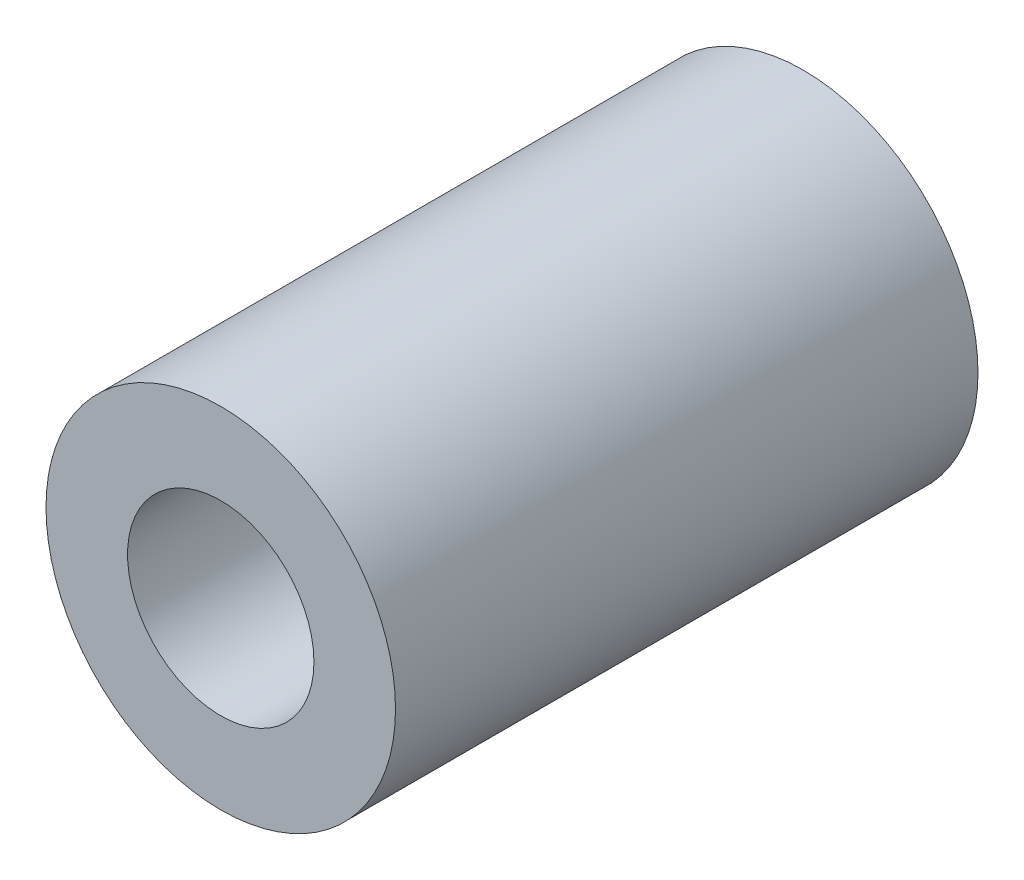
ISO-10303-21;
HEADER;
FILE_DESCRIPTION(('STEP AP214'),'2;1');
FILE_NAME('part.step','',(''),(''),'','','');
FILE_SCHEMA(('AUTOMOTIVE_DESIGN { 1 0 10303 214 1 1 1 1 }'));
ENDSEC;
DATA;
#1=APPLICATION_CONTEXT('core data for automotive mechanical design processes');
#2=APPLICATION_PROTOCOL_DEFINITION('international standard','automotive_design',2000,#1);
#3=PRODUCT_CONTEXT('',#1,'mechanical');
#4=PRODUCT('Part','Part','',(#3));
#5=PRODUCT_RELATED_PRODUCT_CATEGORY('part','',(#4));
#6=PRODUCT_DEFINITION_FORMATION('','',#4);
#7=PRODUCT_DEFINITION_CONTEXT('part definition',#1,'design');
#8=PRODUCT_DEFINITION('design','',#6,#7);
#9=PRODUCT_DEFINITION_SHAPE('','',#8);
#10=(LENGTH_UNIT() NAMED_UNIT(*) SI_UNIT(.MILLI.,.METRE.));
#11=(NAMED_UNIT(*) PLANE_ANGLE_UNIT() SI_UNIT($,.RADIAN.));
#12=(NAMED_UNIT(*) SI_UNIT($,.STERADIAN.) SOLID_ANGLE_UNIT());
#13=UNCERTAINTY_MEASURE_WITH_UNIT(LENGTH_MEASURE(1.E-05),#10,'distance_accuracy_value','');
#14=(GEOMETRIC_REPRESENTATION_CONTEXT(3) GLOBAL_UNCERTAINTY_ASSIGNED_CONTEXT((#13)) GLOBAL_UNIT_ASSIGNED_CONTEXT((#10,
#11,#12)) REPRESENTATION_CONTEXT('',''));
#15=CARTESIAN_POINT('',(0.,0.,0.));
#16=DIRECTION('',(0.,0.,1.));
#17=DIRECTION('',(1.,0.,0.));
#18=AXIS2_PLACEMENT_3D('',#15,#16,#17);
#19=CARTESIAN_POINT('',(0.,0.,5.));
#20=DIRECTION('',(0.,0.,1.));
#21=DIRECTION('',(1.,0.,0.));
#22=AXIS2_PLACEMENT_3D('',#19,#20,#21);
#23=PLANE('',#22);
#24=CARTESIAN_POINT('',(0.,0.,5.));
#25=DIRECTION('',(0.,0.,1.));
#26=DIRECTION('',(1.,0.,0.));
#27=AXIS2_PLACEMENT_3D('',#24,#25,#26);
#28=CIRCLE('',#27,3.);
#29=CARTESIAN_POINT('',(3.,0.,5.));
#30=VERTEX_POINT('',#29);
#31=EDGE_CURVE('E10',#30,#30,#28,.T.);
#32=ORIENTED_EDGE('',*,*,#31,.T.);
#33=EDGE_LOOP('',(#32));
#34=FACE_BOUND('',#33,.T.);
#35=CARTESIAN_POINT('',(0.,0.,5.));
#36=DIRECTION('',(0.,0.,1.));
#37=DIRECTION('',(1.,0.,0.));
#38=AXIS2_PLACEMENT_3D('',#35,#36,#37);
#39=CIRCLE('',#38,1.6);
#40=CARTESIAN_POINT('',(1.6,0.,5.));
#41=VERTEX_POINT('',#40);
#42=EDGE_CURVE('E42',#41,#41,#39,.T.);
#43=ORIENTED_EDGE('',*,*,#42,.F.);
#44=EDGE_LOOP('',(#43));
#45=FACE_BOUND('',#44,.T.);
#46=ADVANCED_FACE('F31',(#34,#45),#23,.T.);
#47=CARTESIAN_POINT('',(0.,0.,-5.));
#48=DIRECTION('',(0.,0.,1.));
#49=DIRECTION('',(1.,0.,0.));
#50=AXIS2_PLACEMENT_3D('',#47,#48,#49);
#51=PLANE('',#50);
#52=CARTESIAN_POINT('',(0.,0.,-5.));
#53=DIRECTION('',(0.,0.,1.));
#54=DIRECTION('',(1.,0.,0.));
#55=AXIS2_PLACEMENT_3D('',#52,#53,#54);
#56=CIRCLE('',#55,3.);
#57=CARTESIAN_POINT('',(3.,0.,-5.));
#58=VERTEX_POINT('',#57);
#59=EDGE_CURVE('E35',#58,#58,#56,.T.);
#60=ORIENTED_EDGE('',*,*,#59,.F.);
#61=EDGE_LOOP('',(#60));
#62=FACE_BOUND('',#61,.T.);
#63=CARTESIAN_POINT('',(0.,0.,-5.));
#64=DIRECTION('',(0.,0.,1.));
#65=DIRECTION('',(1.,0.,0.));
#66=AXIS2_PLACEMENT_3D('',#63,#64,#65);
#67=CIRCLE('',#66,1.6);
#68=CARTESIAN_POINT('',(1.6,0.,-5.));
#69=VERTEX_POINT('',#68);
#70=EDGE_CURVE('E44',#69,#69,#67,.T.);
#71=ORIENTED_EDGE('',*,*,#70,.T.);
#72=EDGE_LOOP('',(#71));
#73=FACE_BOUND('',#72,.T.);
#74=ADVANCED_FACE('F54',(#62,#73),#51,.F.);
#75=CARTESIAN_POINT('',(0.,0.,5.));
#76=DIRECTION('',(0.,0.,-1.));
#77=DIRECTION('',(-1.,0.,0.));
#78=AXIS2_PLACEMENT_3D('',#75,#76,#77);
#79=CYLINDRICAL_SURFACE('',#78,3.);
#80=ORIENTED_EDGE('',*,*,#31,.F.);
#81=EDGE_LOOP('',(#80));
#82=FACE_BOUND('',#81,.T.);
#83=ORIENTED_EDGE('',*,*,#59,.T.);
#84=EDGE_LOOP('',(#83));
#85=FACE_BOUND('',#84,.T.);
#86=ADVANCED_FACE('F33',(#82,#85),#79,.T.);
#87=CARTESIAN_POINT('',(0.,0.,5.));
#88=DIRECTION('',(0.,0.,-1.));
#89=DIRECTION('',(-1.,0.,0.));
#90=AXIS2_PLACEMENT_3D('',#87,#88,#89);
#91=CYLINDRICAL_SURFACE('',#90,1.6);
#92=ORIENTED_EDGE('',*,*,#42,.T.);
#93=EDGE_LOOP('',(#92));
#94=FACE_BOUND('',#93,.T.);
#95=ORIENTED_EDGE('',*,*,#70,.F.);
#96=EDGE_LOOP('',(#95));
#97=FACE_BOUND('',#96,.T.);
#98=ADVANCED_FACE('F50',(#94,#97),#91,.F.);
#99=CLOSED_SHELL('',(#46,#74,#86,#98));
#100=MANIFOLD_SOLID_BREP('B2',#99);
#101=ADVANCED_BREP_SHAPE_REPRESENTATION('',(#18,#100),#14);
#102=SHAPE_DEFINITION_REPRESENTATION(#9,#101);
ENDSEC;
END-ISO-10303-21;
